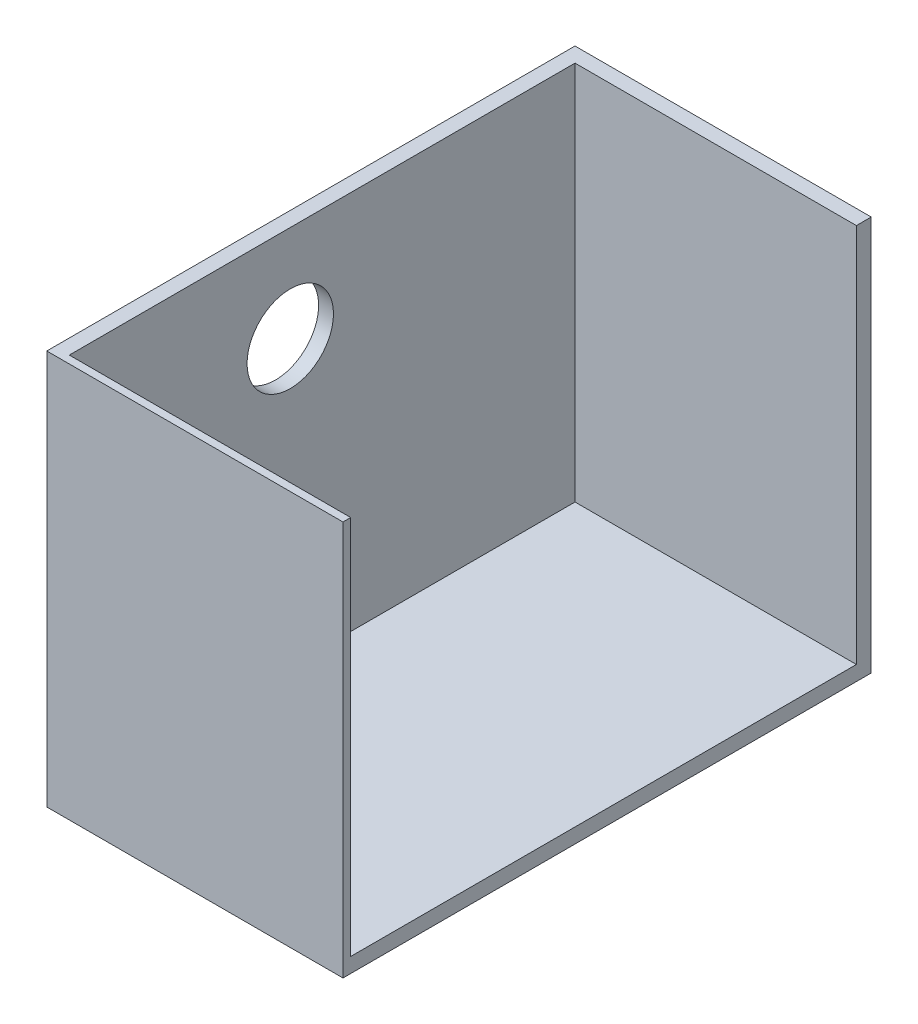
ISO-10303-21;
HEADER;
FILE_DESCRIPTION(('STEP AP214'),'2;1');
FILE_NAME('part.step','',(''),(''),'','','');
FILE_SCHEMA(('AUTOMOTIVE_DESIGN { 1 0 10303 214 1 1 1 1 }'));
ENDSEC;
DATA;
#1=APPLICATION_CONTEXT('core data for automotive mechanical design processes');
#2=APPLICATION_PROTOCOL_DEFINITION('international standard','automotive_design',2000,#1);
#3=PRODUCT_CONTEXT('',#1,'mechanical');
#4=PRODUCT('Part','Part','',(#3));
#5=PRODUCT_RELATED_PRODUCT_CATEGORY('part','',(#4));
#6=PRODUCT_DEFINITION_FORMATION('','',#4);
#7=PRODUCT_DEFINITION_CONTEXT('part definition',#1,'design');
#8=PRODUCT_DEFINITION('design','',#6,#7);
#9=PRODUCT_DEFINITION_SHAPE('','',#8);
#10=(LENGTH_UNIT() NAMED_UNIT(*) SI_UNIT(.MILLI.,.METRE.));
#11=(NAMED_UNIT(*) PLANE_ANGLE_UNIT() SI_UNIT($,.RADIAN.));
#12=(NAMED_UNIT(*) SI_UNIT($,.STERADIAN.) SOLID_ANGLE_UNIT());
#13=UNCERTAINTY_MEASURE_WITH_UNIT(LENGTH_MEASURE(1.E-05),#10,'distance_accuracy_value','');
#14=(GEOMETRIC_REPRESENTATION_CONTEXT(3) GLOBAL_UNCERTAINTY_ASSIGNED_CONTEXT((#13)) GLOBAL_UNIT_ASSIGNED_CONTEXT((#10,
#11,#12)) REPRESENTATION_CONTEXT('',''));
#15=CARTESIAN_POINT('',(0.,0.,0.));
#16=DIRECTION('',(0.,0.,1.));
#17=DIRECTION('',(1.,0.,0.));
#18=AXIS2_PLACEMENT_3D('',#15,#16,#17);
#19=CARTESIAN_POINT('',(0.,160.,0.));
#20=DIRECTION('',(0.,-1.,0.));
#21=DIRECTION('',(0.,0.,-1.));
#22=AXIS2_PLACEMENT_3D('',#19,#20,#21);
#23=PLANE('',#22);
#24=DIRECTION('',(-1.,0.,0.));
#25=VECTOR('',#24,1.);
#26=CARTESIAN_POINT('',(0.,160.,-101.));
#27=LINE('',#26,#25);
#28=CARTESIAN_POINT('',(60.,160.,-101.));
#29=VERTEX_POINT('',#28);
#30=CARTESIAN_POINT('',(-54.,160.,-101.));
#31=VERTEX_POINT('',#30);
#32=EDGE_CURVE('E134',#29,#31,#27,.T.);
#33=ORIENTED_EDGE('',*,*,#32,.F.);
#34=DIRECTION('',(0.,0.,-1.));
#35=VECTOR('',#34,1.);
#36=CARTESIAN_POINT('',(60.,160.,107.));
#37=LINE('',#36,#35);
#38=CARTESIAN_POINT('',(60.,160.,-107.));
#39=VERTEX_POINT('',#38);
#40=EDGE_CURVE('E97',#29,#39,#37,.T.);
#41=ORIENTED_EDGE('',*,*,#40,.T.);
#42=DIRECTION('',(-1.,0.,0.));
#43=VECTOR('',#42,1.);
#44=CARTESIAN_POINT('',(-60.,160.,-107.));
#45=LINE('',#44,#43);
#46=CARTESIAN_POINT('',(-60.,160.,-107.));
#47=VERTEX_POINT('',#46);
#48=EDGE_CURVE('E170',#39,#47,#45,.T.);
#49=ORIENTED_EDGE('',*,*,#48,.T.);
#50=DIRECTION('',(0.,0.,1.));
#51=VECTOR('',#50,1.);
#52=CARTESIAN_POINT('',(-60.,160.,107.));
#53=LINE('',#52,#51);
#54=CARTESIAN_POINT('',(-60.,160.,107.));
#55=VERTEX_POINT('',#54);
#56=EDGE_CURVE('E173',#47,#55,#53,.T.);
#57=ORIENTED_EDGE('',*,*,#56,.T.);
#58=DIRECTION('',(1.,0.,0.));
#59=VECTOR('',#58,1.);
#60=CARTESIAN_POINT('',(-60.,160.,107.));
#61=LINE('',#60,#59);
#62=CARTESIAN_POINT('',(60.,160.,107.));
#63=VERTEX_POINT('',#62);
#64=EDGE_CURVE('E69',#55,#63,#61,.T.);
#65=ORIENTED_EDGE('',*,*,#64,.T.);
#66=CARTESIAN_POINT('',(60.,160.,103.875));
#67=VERTEX_POINT('',#66);
#68=EDGE_CURVE('E167',#63,#67,#37,.T.);
#69=ORIENTED_EDGE('',*,*,#68,.T.);
#70=DIRECTION('',(1.,0.,0.));
#71=VECTOR('',#70,1.);
#72=CARTESIAN_POINT('',(0.,160.,103.875));
#73=LINE('',#72,#71);
#74=CARTESIAN_POINT('',(-54.,160.,103.875));
#75=VERTEX_POINT('',#74);
#76=EDGE_CURVE('E155',#75,#67,#73,.T.);
#77=ORIENTED_EDGE('',*,*,#76,.F.);
#78=DIRECTION('',(0.,0.,1.));
#79=VECTOR('',#78,1.);
#80=CARTESIAN_POINT('',(-54.,160.,0.));
#81=LINE('',#80,#79);
#82=EDGE_CURVE('E152',#31,#75,#81,.T.);
#83=ORIENTED_EDGE('',*,*,#82,.F.);
#84=EDGE_LOOP('',(#33,#41,#49,#57,#65,#69,#77,#83));
#85=FACE_BOUND('',#84,.T.);
#86=ADVANCED_FACE('F44',(#85),#23,.F.);
#87=CARTESIAN_POINT('',(60.,160.,107.));
#88=DIRECTION('',(-1.,0.,0.));
#89=DIRECTION('',(0.,0.,1.));
#90=AXIS2_PLACEMENT_3D('',#87,#88,#89);
#91=PLANE('',#90);
#92=ORIENTED_EDGE('',*,*,#40,.F.);
#93=DIRECTION('',(0.,-1.,0.));
#94=VECTOR('',#93,1.);
#95=CARTESIAN_POINT('',(60.,160.,-101.));
#96=LINE('',#95,#94);
#97=CARTESIAN_POINT('',(60.,6.,-101.));
#98=VERTEX_POINT('',#97);
#99=EDGE_CURVE('E138',#29,#98,#96,.T.);
#100=ORIENTED_EDGE('',*,*,#99,.T.);
#101=DIRECTION('',(0.,0.,-1.));
#102=VECTOR('',#101,1.);
#103=CARTESIAN_POINT('',(60.,6.,0.));
#104=LINE('',#103,#102);
#105=CARTESIAN_POINT('',(60.,6.,103.875));
#106=VERTEX_POINT('',#105);
#107=EDGE_CURVE('E126',#106,#98,#104,.T.);
#108=ORIENTED_EDGE('',*,*,#107,.F.);
#109=DIRECTION('',(0.,-1.,0.));
#110=VECTOR('',#109,1.);
#111=CARTESIAN_POINT('',(60.,160.,103.875));
#112=LINE('',#111,#110);
#113=EDGE_CURVE('E148',#67,#106,#112,.T.);
#114=ORIENTED_EDGE('',*,*,#113,.F.);
#115=ORIENTED_EDGE('',*,*,#68,.F.);
#116=DIRECTION('',(0.,-1.,0.));
#117=VECTOR('',#116,1.);
#118=CARTESIAN_POINT('',(60.,160.,107.));
#119=LINE('',#118,#117);
#120=CARTESIAN_POINT('',(60.,0.,107.));
#121=VERTEX_POINT('',#120);
#122=EDGE_CURVE('E178',#63,#121,#119,.T.);
#123=ORIENTED_EDGE('',*,*,#122,.T.);
#124=DIRECTION('',(0.,0.,-1.));
#125=VECTOR('',#124,1.);
#126=CARTESIAN_POINT('',(60.,0.,107.));
#127=LINE('',#126,#125);
#128=CARTESIAN_POINT('',(60.,0.,-107.));
#129=VERTEX_POINT('',#128);
#130=EDGE_CURVE('E166',#121,#129,#127,.T.);
#131=ORIENTED_EDGE('',*,*,#130,.T.);
#132=DIRECTION('',(0.,-1.,0.));
#133=VECTOR('',#132,1.);
#134=CARTESIAN_POINT('',(60.,160.,-107.));
#135=LINE('',#134,#133);
#136=EDGE_CURVE('E11',#39,#129,#135,.T.);
#137=ORIENTED_EDGE('',*,*,#136,.F.);
#138=EDGE_LOOP('',(#92,#100,#108,#114,#115,#123,#131,#137));
#139=FACE_BOUND('',#138,.T.);
#140=ADVANCED_FACE('F46',(#139),#91,.F.);
#141=CARTESIAN_POINT('',(-60.,160.,-107.));
#142=DIRECTION('',(0.,0.,1.));
#143=DIRECTION('',(1.,0.,0.));
#144=AXIS2_PLACEMENT_3D('',#141,#142,#143);
#145=PLANE('',#144);
#146=DIRECTION('',(-1.,0.,0.));
#147=VECTOR('',#146,1.);
#148=CARTESIAN_POINT('',(-60.,0.,-107.));
#149=LINE('',#148,#147);
#150=CARTESIAN_POINT('',(-60.,0.,-107.));
#151=VERTEX_POINT('',#150);
#152=EDGE_CURVE('E182',#129,#151,#149,.T.);
#153=ORIENTED_EDGE('',*,*,#152,.T.);
#154=DIRECTION('',(0.,-1.,0.));
#155=VECTOR('',#154,1.);
#156=CARTESIAN_POINT('',(-60.,160.,-107.));
#157=LINE('',#156,#155);
#158=EDGE_CURVE('E53',#47,#151,#157,.T.);
#159=ORIENTED_EDGE('',*,*,#158,.F.);
#160=ORIENTED_EDGE('',*,*,#48,.F.);
#161=ORIENTED_EDGE('',*,*,#136,.T.);
#162=EDGE_LOOP('',(#153,#159,#160,#161));
#163=FACE_BOUND('',#162,.T.);
#164=ADVANCED_FACE('F219',(#163),#145,.F.);
#165=CARTESIAN_POINT('',(-60.,160.,107.));
#166=DIRECTION('',(1.,0.,0.));
#167=DIRECTION('',(0.,0.,-1.));
#168=AXIS2_PLACEMENT_3D('',#165,#166,#167);
#169=PLANE('',#168);
#170=CARTESIAN_POINT('',(-60.,120.976954775649,14.3614950447005));
#171=DIRECTION('',(-1.,0.,0.));
#172=DIRECTION('',(0.,0.,1.));
#173=AXIS2_PLACEMENT_3D('',#170,#171,#172);
#174=CIRCLE('',#173,17.5);
#175=CARTESIAN_POINT('',(-60.,120.976954775649,31.8614950447005));
#176=VERTEX_POINT('',#175);
#177=EDGE_CURVE('E163',#176,#176,#174,.T.);
#178=ORIENTED_EDGE('',*,*,#177,.F.);
#179=EDGE_LOOP('',(#178));
#180=FACE_BOUND('',#179,.T.);
#181=DIRECTION('',(0.,0.,1.));
#182=VECTOR('',#181,1.);
#183=CARTESIAN_POINT('',(-60.,0.,107.));
#184=LINE('',#183,#182);
#185=CARTESIAN_POINT('',(-60.,0.,107.));
#186=VERTEX_POINT('',#185);
#187=EDGE_CURVE('E185',#151,#186,#184,.T.);
#188=ORIENTED_EDGE('',*,*,#187,.T.);
#189=DIRECTION('',(0.,-1.,0.));
#190=VECTOR('',#189,1.);
#191=CARTESIAN_POINT('',(-60.,160.,107.));
#192=LINE('',#191,#190);
#193=EDGE_CURVE('E192',#55,#186,#192,.T.);
#194=ORIENTED_EDGE('',*,*,#193,.F.);
#195=ORIENTED_EDGE('',*,*,#56,.F.);
#196=ORIENTED_EDGE('',*,*,#158,.T.);
#197=EDGE_LOOP('',(#188,#194,#195,#196));
#198=FACE_BOUND('',#197,.T.);
#199=ADVANCED_FACE('F200',(#180,#198),#169,.F.);
#200=CARTESIAN_POINT('',(-60.,160.,107.));
#201=DIRECTION('',(0.,0.,-1.));
#202=DIRECTION('',(-1.,0.,0.));
#203=AXIS2_PLACEMENT_3D('',#200,#201,#202);
#204=PLANE('',#203);
#205=DIRECTION('',(1.,0.,0.));
#206=VECTOR('',#205,1.);
#207=CARTESIAN_POINT('',(-60.,0.,107.));
#208=LINE('',#207,#206);
#209=EDGE_CURVE('E90',#186,#121,#208,.T.);
#210=ORIENTED_EDGE('',*,*,#209,.T.);
#211=ORIENTED_EDGE('',*,*,#122,.F.);
#212=ORIENTED_EDGE('',*,*,#64,.F.);
#213=ORIENTED_EDGE('',*,*,#193,.T.);
#214=EDGE_LOOP('',(#210,#211,#212,#213));
#215=FACE_BOUND('',#214,.T.);
#216=ADVANCED_FACE('F210',(#215),#204,.F.);
#217=CARTESIAN_POINT('',(0.,0.,0.));
#218=DIRECTION('',(0.,-1.,0.));
#219=DIRECTION('',(0.,0.,-1.));
#220=AXIS2_PLACEMENT_3D('',#217,#218,#219);
#221=PLANE('',#220);
#222=ORIENTED_EDGE('',*,*,#130,.F.);
#223=ORIENTED_EDGE('',*,*,#209,.F.);
#224=ORIENTED_EDGE('',*,*,#187,.F.);
#225=ORIENTED_EDGE('',*,*,#152,.F.);
#226=EDGE_LOOP('',(#222,#223,#224,#225));
#227=FACE_BOUND('',#226,.T.);
#228=ADVANCED_FACE('F205',(#227),#221,.T.);
#229=CARTESIAN_POINT('',(-60.,160.,-101.));
#230=DIRECTION('',(0.,0.,1.));
#231=DIRECTION('',(1.,0.,0.));
#232=AXIS2_PLACEMENT_3D('',#229,#230,#231);
#233=PLANE('',#232);
#234=DIRECTION('',(-1.,0.,0.));
#235=VECTOR('',#234,1.);
#236=CARTESIAN_POINT('',(0.,6.,-101.));
#237=LINE('',#236,#235);
#238=CARTESIAN_POINT('',(-54.,6.,-101.));
#239=VERTEX_POINT('',#238);
#240=EDGE_CURVE('E120',#98,#239,#237,.T.);
#241=ORIENTED_EDGE('',*,*,#240,.F.);
#242=ORIENTED_EDGE('',*,*,#99,.F.);
#243=ORIENTED_EDGE('',*,*,#32,.T.);
#244=DIRECTION('',(0.,-1.,0.));
#245=VECTOR('',#244,1.);
#246=CARTESIAN_POINT('',(-54.,160.,-101.));
#247=LINE('',#246,#245);
#248=EDGE_CURVE('E132',#31,#239,#247,.T.);
#249=ORIENTED_EDGE('',*,*,#248,.T.);
#250=EDGE_LOOP('',(#241,#242,#243,#249));
#251=FACE_BOUND('',#250,.T.);
#252=ADVANCED_FACE('F133',(#251),#233,.T.);
#253=CARTESIAN_POINT('',(-54.,160.,107.));
#254=DIRECTION('',(1.,0.,0.));
#255=DIRECTION('',(0.,0.,-1.));
#256=AXIS2_PLACEMENT_3D('',#253,#254,#255);
#257=PLANE('',#256);
#258=CARTESIAN_POINT('',(-54.,120.976954775649,14.3614950447005));
#259=DIRECTION('',(1.,0.,0.));
#260=DIRECTION('',(0.,0.,-1.));
#261=AXIS2_PLACEMENT_3D('',#258,#259,#260);
#262=CIRCLE('',#261,17.5);
#263=CARTESIAN_POINT('',(-54.,120.976954775649,-3.13850495529949));
#264=VERTEX_POINT('',#263);
#265=EDGE_CURVE('E246',#264,#264,#262,.F.);
#266=ORIENTED_EDGE('',*,*,#265,.T.);
#267=EDGE_LOOP('',(#266));
#268=FACE_BOUND('',#267,.T.);
#269=DIRECTION('',(0.,0.,1.));
#270=VECTOR('',#269,1.);
#271=CARTESIAN_POINT('',(-54.,6.,0.));
#272=LINE('',#271,#270);
#273=CARTESIAN_POINT('',(-54.,6.,103.875));
#274=VERTEX_POINT('',#273);
#275=EDGE_CURVE('E124',#239,#274,#272,.T.);
#276=ORIENTED_EDGE('',*,*,#275,.F.);
#277=ORIENTED_EDGE('',*,*,#248,.F.);
#278=ORIENTED_EDGE('',*,*,#82,.T.);
#279=DIRECTION('',(0.,-1.,0.));
#280=VECTOR('',#279,1.);
#281=CARTESIAN_POINT('',(-54.,160.,103.875));
#282=LINE('',#281,#280);
#283=EDGE_CURVE('E60',#75,#274,#282,.T.);
#284=ORIENTED_EDGE('',*,*,#283,.T.);
#285=EDGE_LOOP('',(#276,#277,#278,#284));
#286=FACE_BOUND('',#285,.T.);
#287=ADVANCED_FACE('F140',(#268,#286),#257,.T.);
#288=CARTESIAN_POINT('',(-60.,160.,103.875));
#289=DIRECTION('',(0.,0.,-1.));
#290=DIRECTION('',(-1.,0.,0.));
#291=AXIS2_PLACEMENT_3D('',#288,#289,#290);
#292=PLANE('',#291);
#293=DIRECTION('',(1.,0.,0.));
#294=VECTOR('',#293,1.);
#295=CARTESIAN_POINT('',(0.,6.,103.875));
#296=LINE('',#295,#294);
#297=EDGE_CURVE('E142',#274,#106,#296,.T.);
#298=ORIENTED_EDGE('',*,*,#297,.F.);
#299=ORIENTED_EDGE('',*,*,#283,.F.);
#300=ORIENTED_EDGE('',*,*,#76,.T.);
#301=ORIENTED_EDGE('',*,*,#113,.T.);
#302=EDGE_LOOP('',(#298,#299,#300,#301));
#303=FACE_BOUND('',#302,.T.);
#304=ADVANCED_FACE('F231',(#303),#292,.T.);
#305=CARTESIAN_POINT('',(0.,6.,0.));
#306=DIRECTION('',(0.,-1.,0.));
#307=DIRECTION('',(0.,0.,-1.));
#308=AXIS2_PLACEMENT_3D('',#305,#306,#307);
#309=PLANE('',#308);
#310=ORIENTED_EDGE('',*,*,#107,.T.);
#311=ORIENTED_EDGE('',*,*,#240,.T.);
#312=ORIENTED_EDGE('',*,*,#275,.T.);
#313=ORIENTED_EDGE('',*,*,#297,.T.);
#314=EDGE_LOOP('',(#310,#311,#312,#313));
#315=FACE_BOUND('',#314,.T.);
#316=ADVANCED_FACE('F122',(#315),#309,.F.);
#317=CARTESIAN_POINT('',(60.001,120.976954775649,14.3614950447005));
#318=DIRECTION('',(-1.,0.,0.));
#319=DIRECTION('',(0.,0.,1.));
#320=AXIS2_PLACEMENT_3D('',#317,#318,#319);
#321=CYLINDRICAL_SURFACE('',#320,17.5);
#322=ORIENTED_EDGE('',*,*,#265,.F.);
#323=EDGE_LOOP('',(#322));
#324=FACE_BOUND('',#323,.T.);
#325=ORIENTED_EDGE('',*,*,#177,.T.);
#326=EDGE_LOOP('',(#325));
#327=FACE_BOUND('',#326,.T.);
#328=ADVANCED_FACE('F230',(#324,#327),#321,.F.);
#329=CLOSED_SHELL('',(#86,#140,#164,#199,#216,#228,#252,#287,#304,#316,#328));
#330=MANIFOLD_SOLID_BREP('B2',#329);
#331=ADVANCED_BREP_SHAPE_REPRESENTATION('',(#18,#330),#14);
#332=SHAPE_DEFINITION_REPRESENTATION(#9,#331);
ENDSEC;
END-ISO-10303-21;
